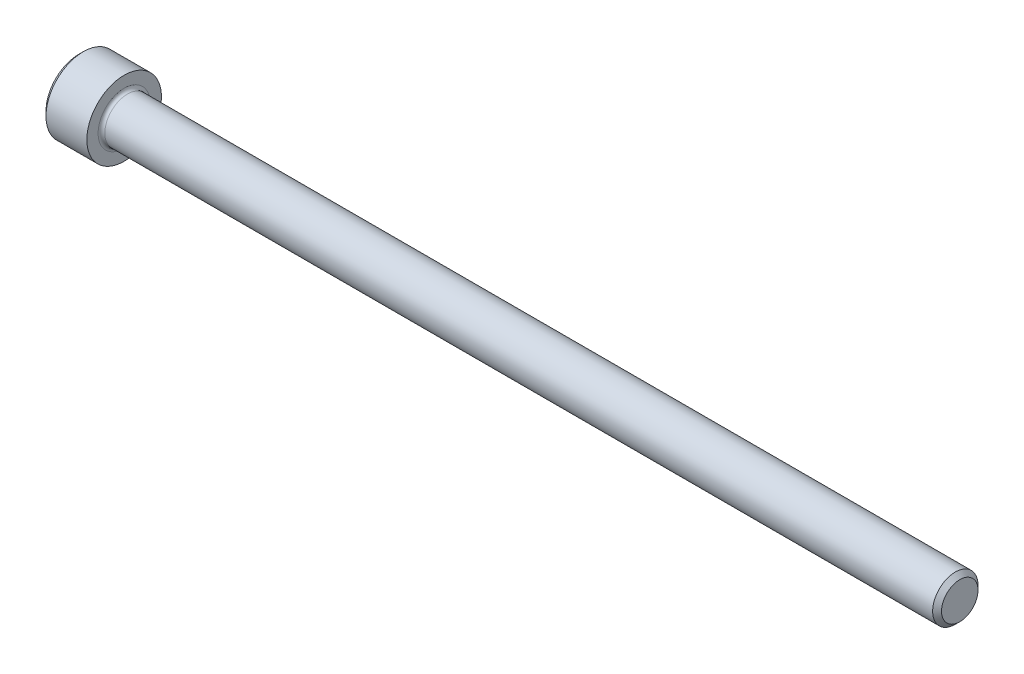
ISO-10303-21;
HEADER;
FILE_DESCRIPTION(('STEP AP214'),'2;1');
FILE_NAME('part.step','',(''),(''),'','','');
FILE_SCHEMA(('AUTOMOTIVE_DESIGN { 1 0 10303 214 1 1 1 1 }'));
ENDSEC;
DATA;
#1=APPLICATION_CONTEXT('core data for automotive mechanical design processes');
#2=APPLICATION_PROTOCOL_DEFINITION('international standard','automotive_design',2000,#1);
#3=PRODUCT_CONTEXT('',#1,'mechanical');
#4=PRODUCT('Part','Part','',(#3));
#5=PRODUCT_RELATED_PRODUCT_CATEGORY('part','',(#4));
#6=PRODUCT_DEFINITION_FORMATION('','',#4);
#7=PRODUCT_DEFINITION_CONTEXT('part definition',#1,'design');
#8=PRODUCT_DEFINITION('design','',#6,#7);
#9=PRODUCT_DEFINITION_SHAPE('','',#8);
#10=(LENGTH_UNIT() NAMED_UNIT(*) SI_UNIT(.MILLI.,.METRE.));
#11=(NAMED_UNIT(*) PLANE_ANGLE_UNIT() SI_UNIT($,.RADIAN.));
#12=(NAMED_UNIT(*) SI_UNIT($,.STERADIAN.) SOLID_ANGLE_UNIT());
#13=UNCERTAINTY_MEASURE_WITH_UNIT(LENGTH_MEASURE(1.E-05),#10,'distance_accuracy_value','');
#14=(GEOMETRIC_REPRESENTATION_CONTEXT(3) GLOBAL_UNCERTAINTY_ASSIGNED_CONTEXT((#13)) GLOBAL_UNIT_ASSIGNED_CONTEXT((#10,
#11,#12)) REPRESENTATION_CONTEXT('',''));
#15=CARTESIAN_POINT('',(0.,0.,0.));
#16=DIRECTION('',(0.,0.,1.));
#17=DIRECTION('',(1.,0.,0.));
#18=AXIS2_PLACEMENT_3D('',#15,#16,#17);
#19=CARTESIAN_POINT('',(2.286,3.4381381735323,-1.98501));
#20=DIRECTION('',(1.,0.,0.));
#21=DIRECTION('',(0.,0.,-1.));
#22=AXIS2_PLACEMENT_3D('',#19,#20,#21);
#23=PLANE('',#22);
#24=DIRECTION('',(0.,1.,0.));
#25=VECTOR('',#24,1.);
#26=CARTESIAN_POINT('',(2.286,3.4381381735323,1.98501));
#27=LINE('',#26,#25);
#28=CARTESIAN_POINT('',(2.28600000001322,0.,1.98501000002768));
#29=VERTEX_POINT('',#28);
#30=CARTESIAN_POINT('',(2.286,-1.14604605784409,1.98501));
#31=VERTEX_POINT('',#30);
#32=EDGE_CURVE('E96',#29,#31,#27,.F.);
#33=ORIENTED_EDGE('',*,*,#32,.F.);
#34=CARTESIAN_POINT('',(2.28600000002643,0.,0.));
#35=DIRECTION('',(-1.,0.,0.));
#36=DIRECTION('',(0.,0.,1.));
#37=AXIS2_PLACEMENT_3D('',#34,#35,#36);
#38=CIRCLE('',#37,1.98501000005535);
#39=CARTESIAN_POINT('',(2.28600000001322,-1.71906908679011,0.992505000013839));
#40=VERTEX_POINT('',#39);
#41=EDGE_CURVE('E98',#29,#40,#38,.F.);
#42=ORIENTED_EDGE('',*,*,#41,.T.);
#43=DIRECTION('',(0.,-0.5,-0.866025403784438));
#44=VECTOR('',#43,1.);
#45=CARTESIAN_POINT('',(2.286,-1.14604605784409,1.98501));
#46=LINE('',#45,#44);
#47=EDGE_CURVE('E101',#31,#40,#46,.T.);
#48=ORIENTED_EDGE('',*,*,#47,.F.);
#49=EDGE_LOOP('',(#33,#42,#48));
#50=FACE_BOUND('',#49,.T.);
#51=ADVANCED_FACE('F17',(#50),#23,.F.);
#52=CARTESIAN_POINT('',(2.286,3.4381381735323,-1.98501));
#53=DIRECTION('',(1.,0.,0.));
#54=DIRECTION('',(0.,0.,-1.));
#55=AXIS2_PLACEMENT_3D('',#52,#53,#54);
#56=PLANE('',#55);
#57=DIRECTION('',(0.,-0.500000000000002,-0.866025403784438));
#58=VECTOR('',#57,1.);
#59=CARTESIAN_POINT('',(2.286,-1.71906908676614,0.992504999999999));
#60=LINE('',#59,#58);
#61=CARTESIAN_POINT('',(2.286,-2.29209211568819,0.));
#62=VERTEX_POINT('',#61);
#63=EDGE_CURVE('E169',#40,#62,#60,.T.);
#64=ORIENTED_EDGE('',*,*,#63,.F.);
#65=CARTESIAN_POINT('',(2.28600000002643,0.,0.));
#66=DIRECTION('',(-1.,0.,0.));
#67=DIRECTION('',(0.,0.,1.));
#68=AXIS2_PLACEMENT_3D('',#65,#66,#67);
#69=CIRCLE('',#68,1.98501000005535);
#70=CARTESIAN_POINT('',(2.28600000001322,-1.71906908679012,-0.992505000013834));
#71=VERTEX_POINT('',#70);
#72=EDGE_CURVE('E116',#40,#71,#69,.F.);
#73=ORIENTED_EDGE('',*,*,#72,.T.);
#74=DIRECTION('',(0.,0.499999999999999,-0.866025403784439));
#75=VECTOR('',#74,1.);
#76=CARTESIAN_POINT('',(2.286,-2.29209211568819,0.));
#77=LINE('',#76,#75);
#78=EDGE_CURVE('E165',#62,#71,#77,.T.);
#79=ORIENTED_EDGE('',*,*,#78,.F.);
#80=EDGE_LOOP('',(#64,#73,#79));
#81=FACE_BOUND('',#80,.T.);
#82=ADVANCED_FACE('F341',(#81),#56,.F.);
#83=CARTESIAN_POINT('',(2.286,3.4381381735323,-1.98501));
#84=DIRECTION('',(1.,0.,0.));
#85=DIRECTION('',(0.,0.,-1.));
#86=AXIS2_PLACEMENT_3D('',#83,#84,#85);
#87=PLANE('',#86);
#88=DIRECTION('',(0.,0.499999999999997,-0.86602540378444));
#89=VECTOR('',#88,1.);
#90=CARTESIAN_POINT('',(2.286,-1.71906908676615,-0.992504999999994));
#91=LINE('',#90,#89);
#92=CARTESIAN_POINT('',(2.286,-1.1460460578441,-1.98501));
#93=VERTEX_POINT('',#92);
#94=EDGE_CURVE('E161',#71,#93,#91,.T.);
#95=ORIENTED_EDGE('',*,*,#94,.F.);
#96=CARTESIAN_POINT('',(2.28600000002643,0.,0.));
#97=DIRECTION('',(-1.,0.,0.));
#98=DIRECTION('',(0.,0.,1.));
#99=AXIS2_PLACEMENT_3D('',#96,#97,#98);
#100=CIRCLE('',#99,1.98501000005535);
#101=CARTESIAN_POINT('',(2.28600000001322,0.,-1.98501000002768));
#102=VERTEX_POINT('',#101);
#103=EDGE_CURVE('E218',#71,#102,#100,.F.);
#104=ORIENTED_EDGE('',*,*,#103,.T.);
#105=DIRECTION('',(0.,1.,0.));
#106=VECTOR('',#105,1.);
#107=CARTESIAN_POINT('',(2.286,3.4381381735323,-1.98501));
#108=LINE('',#107,#106);
#109=EDGE_CURVE('E157',#93,#102,#108,.T.);
#110=ORIENTED_EDGE('',*,*,#109,.F.);
#111=EDGE_LOOP('',(#95,#104,#110));
#112=FACE_BOUND('',#111,.T.);
#113=ADVANCED_FACE('F338',(#112),#87,.F.);
#114=CARTESIAN_POINT('',(2.286,3.4381381735323,-1.98501));
#115=DIRECTION('',(1.,0.,0.));
#116=DIRECTION('',(0.,0.,-1.));
#117=AXIS2_PLACEMENT_3D('',#114,#115,#116);
#118=PLANE('',#117);
#119=DIRECTION('',(0.,1.,0.));
#120=VECTOR('',#119,1.);
#121=CARTESIAN_POINT('',(2.286,3.4381381735323,-1.98501));
#122=LINE('',#121,#120);
#123=CARTESIAN_POINT('',(2.286,1.1460460578441,-1.98501));
#124=VERTEX_POINT('',#123);
#125=EDGE_CURVE('E153',#102,#124,#122,.T.);
#126=ORIENTED_EDGE('',*,*,#125,.F.);
#127=CARTESIAN_POINT('',(2.28600000002643,0.,0.));
#128=DIRECTION('',(-1.,0.,0.));
#129=DIRECTION('',(0.,0.,1.));
#130=AXIS2_PLACEMENT_3D('',#127,#128,#129);
#131=CIRCLE('',#130,1.98501000005535);
#132=CARTESIAN_POINT('',(2.28600000001322,1.71906908679012,-0.992505000013842));
#133=VERTEX_POINT('',#132);
#134=EDGE_CURVE('E215',#102,#133,#131,.F.);
#135=ORIENTED_EDGE('',*,*,#134,.T.);
#136=DIRECTION('',(0.,0.500000000000001,0.866025403784438));
#137=VECTOR('',#136,1.);
#138=CARTESIAN_POINT('',(2.286,1.1460460578441,-1.98501));
#139=LINE('',#138,#137);
#140=EDGE_CURVE('E149',#124,#133,#139,.T.);
#141=ORIENTED_EDGE('',*,*,#140,.F.);
#142=EDGE_LOOP('',(#126,#135,#141));
#143=FACE_BOUND('',#142,.T.);
#144=ADVANCED_FACE('F334',(#143),#118,.F.);
#145=CARTESIAN_POINT('',(2.286,3.4381381735323,-1.98501));
#146=DIRECTION('',(1.,0.,0.));
#147=DIRECTION('',(0.,0.,-1.));
#148=AXIS2_PLACEMENT_3D('',#145,#146,#147);
#149=PLANE('',#148);
#150=DIRECTION('',(0.,0.500000000000001,0.866025403784438));
#151=VECTOR('',#150,1.);
#152=CARTESIAN_POINT('',(2.286,1.71906908676615,-0.992505000000004));
#153=LINE('',#152,#151);
#154=CARTESIAN_POINT('',(2.286,2.2920921156882,0.));
#155=VERTEX_POINT('',#154);
#156=EDGE_CURVE('E145',#133,#155,#153,.T.);
#157=ORIENTED_EDGE('',*,*,#156,.F.);
#158=CARTESIAN_POINT('',(2.28600000002643,0.,0.));
#159=DIRECTION('',(-1.,0.,0.));
#160=DIRECTION('',(0.,0.,1.));
#161=AXIS2_PLACEMENT_3D('',#158,#159,#160);
#162=CIRCLE('',#161,1.98501000005535);
#163=CARTESIAN_POINT('',(2.28600000001322,1.71906908679012,0.992505000013836));
#164=VERTEX_POINT('',#163);
#165=EDGE_CURVE('E124',#133,#164,#162,.F.);
#166=ORIENTED_EDGE('',*,*,#165,.T.);
#167=DIRECTION('',(0.,-0.499999999999999,0.866025403784439));
#168=VECTOR('',#167,1.);
#169=CARTESIAN_POINT('',(2.286,2.2920921156882,0.));
#170=LINE('',#169,#168);
#171=EDGE_CURVE('E117',#155,#164,#170,.T.);
#172=ORIENTED_EDGE('',*,*,#171,.F.);
#173=EDGE_LOOP('',(#157,#166,#172));
#174=FACE_BOUND('',#173,.T.);
#175=ADVANCED_FACE('F330',(#174),#149,.F.);
#176=CARTESIAN_POINT('',(2.28600000002643,0.,0.));
#177=DIRECTION('',(-1.,0.,0.));
#178=DIRECTION('',(0.,0.,1.));
#179=AXIS2_PLACEMENT_3D('',#176,#177,#178);
#180=CONICAL_SURFACE('',#179,1.98501000005535,1.04719755117615);
#181=CARTESIAN_POINT('',(3.43204605781011,0.,1.70530256582424E-10));
#182=VERTEX_POINT('',#181);
#183=VERTEX_LOOP('',#182);
#184=FACE_BOUND('',#183,.T.);
#185=ORIENTED_EDGE('',*,*,#41,.F.);
#186=CARTESIAN_POINT('',(2.28600000002643,0.,0.));
#187=DIRECTION('',(-1.,0.,0.));
#188=DIRECTION('',(0.,0.,1.));
#189=AXIS2_PLACEMENT_3D('',#186,#187,#188);
#190=CIRCLE('',#189,1.98501000005535);
#191=EDGE_CURVE('E112',#29,#164,#190,.T.);
#192=ORIENTED_EDGE('',*,*,#191,.T.);
#193=ORIENTED_EDGE('',*,*,#165,.F.);
#194=ORIENTED_EDGE('',*,*,#134,.F.);
#195=ORIENTED_EDGE('',*,*,#103,.F.);
#196=ORIENTED_EDGE('',*,*,#72,.F.);
#197=EDGE_LOOP('',(#185,#192,#193,#194,#195,#196));
#198=FACE_BOUND('',#197,.T.);
#199=ADVANCED_FACE('F110',(#184,#198),#180,.F.);
#200=CARTESIAN_POINT('',(2.286,3.4381381735323,-1.98501));
#201=DIRECTION('',(1.,0.,0.));
#202=DIRECTION('',(0.,0.,-1.));
#203=AXIS2_PLACEMENT_3D('',#200,#201,#202);
#204=PLANE('',#203);
#205=DIRECTION('',(0.,0.499999999999999,-0.866025403784439));
#206=VECTOR('',#205,1.);
#207=CARTESIAN_POINT('',(2.286,2.2920921156882,0.));
#208=LINE('',#207,#206);
#209=CARTESIAN_POINT('',(2.286,1.14604605784411,1.98501));
#210=VERTEX_POINT('',#209);
#211=EDGE_CURVE('E123',#164,#210,#208,.F.);
#212=ORIENTED_EDGE('',*,*,#211,.F.);
#213=ORIENTED_EDGE('',*,*,#191,.F.);
#214=DIRECTION('',(0.,-1.,0.));
#215=VECTOR('',#214,1.);
#216=CARTESIAN_POINT('',(2.286,-1.14604605784409,1.98501));
#217=LINE('',#216,#215);
#218=EDGE_CURVE('E121',#29,#210,#217,.F.);
#219=ORIENTED_EDGE('',*,*,#218,.T.);
#220=EDGE_LOOP('',(#212,#213,#219));
#221=FACE_BOUND('',#220,.T.);
#222=ADVANCED_FACE('F120',(#221),#204,.F.);
#223=CARTESIAN_POINT('',(2.286,2.2920921156882,0.));
#224=DIRECTION('',(0.,-0.866025403784439,-0.499999999999999));
#225=DIRECTION('',(0.,0.499999999999999,-0.866025403784439));
#226=AXIS2_PLACEMENT_3D('',#223,#224,#225);
#227=PLANE('',#226);
#228=ORIENTED_EDGE('',*,*,#211,.T.);
#229=DIRECTION('',(1.,0.,0.));
#230=VECTOR('',#229,1.);
#231=CARTESIAN_POINT('',(2.286,1.14604605784411,1.98501));
#232=LINE('',#231,#230);
#233=CARTESIAN_POINT('',(0.,1.14604605784411,1.98501));
#234=VERTEX_POINT('',#233);
#235=EDGE_CURVE('E129',#210,#234,#232,.F.);
#236=ORIENTED_EDGE('',*,*,#235,.T.);
#237=DIRECTION('',(0.,-0.499999999999999,0.866025403784439));
#238=VECTOR('',#237,1.);
#239=CARTESIAN_POINT('',(0.,2.2920921156882,0.));
#240=LINE('',#239,#238);
#241=CARTESIAN_POINT('',(0.,2.2920921156882,0.));
#242=VERTEX_POINT('',#241);
#243=EDGE_CURVE('E136',#242,#234,#240,.T.);
#244=ORIENTED_EDGE('',*,*,#243,.F.);
#245=DIRECTION('',(1.,0.,0.));
#246=VECTOR('',#245,1.);
#247=CARTESIAN_POINT('',(2.286,2.2920921156882,0.));
#248=LINE('',#247,#246);
#249=EDGE_CURVE('E180',#242,#155,#248,.T.);
#250=ORIENTED_EDGE('',*,*,#249,.T.);
#251=ORIENTED_EDGE('',*,*,#171,.T.);
#252=EDGE_LOOP('',(#228,#236,#244,#250,#251));
#253=FACE_BOUND('',#252,.T.);
#254=ADVANCED_FACE('F322',(#253),#227,.T.);
#255=CARTESIAN_POINT('',(2.286,-1.14604605784409,1.98501));
#256=DIRECTION('',(0.,0.,1.));
#257=DIRECTION('',(0.,-1.,0.));
#258=AXIS2_PLACEMENT_3D('',#255,#256,#257);
#259=PLANE('',#258);
#260=ORIENTED_EDGE('',*,*,#235,.F.);
#261=ORIENTED_EDGE('',*,*,#218,.F.);
#262=ORIENTED_EDGE('',*,*,#32,.T.);
#263=DIRECTION('',(1.,0.,0.));
#264=VECTOR('',#263,1.);
#265=CARTESIAN_POINT('',(2.286,-1.14604605784409,1.98501));
#266=LINE('',#265,#264);
#267=CARTESIAN_POINT('',(0.,-1.14604605784409,1.98501));
#268=VERTEX_POINT('',#267);
#269=EDGE_CURVE('E131',#268,#31,#266,.T.);
#270=ORIENTED_EDGE('',*,*,#269,.F.);
#271=DIRECTION('',(0.,1.,0.));
#272=VECTOR('',#271,1.);
#273=CARTESIAN_POINT('',(0.,0.,1.98501));
#274=LINE('',#273,#272);
#275=EDGE_CURVE('E364',#234,#268,#274,.F.);
#276=ORIENTED_EDGE('',*,*,#275,.F.);
#277=EDGE_LOOP('',(#260,#261,#262,#270,#276));
#278=FACE_BOUND('',#277,.T.);
#279=ADVANCED_FACE('F127',(#278),#259,.F.);
#280=CARTESIAN_POINT('',(2.286,-1.14604605784409,1.98501));
#281=DIRECTION('',(0.,0.866025403784438,-0.500000000000001));
#282=DIRECTION('',(0.,0.500000000000001,0.866025403784438));
#283=AXIS2_PLACEMENT_3D('',#280,#281,#282);
#284=PLANE('',#283);
#285=ORIENTED_EDGE('',*,*,#63,.T.);
#286=DIRECTION('',(1.,0.,0.));
#287=VECTOR('',#286,1.);
#288=CARTESIAN_POINT('',(2.286,-2.29209211568819,0.));
#289=LINE('',#288,#287);
#290=CARTESIAN_POINT('',(0.,-2.29209211568819,0.));
#291=VERTEX_POINT('',#290);
#292=EDGE_CURVE('E191',#291,#62,#289,.T.);
#293=ORIENTED_EDGE('',*,*,#292,.F.);
#294=DIRECTION('',(0.,-0.500000000000001,-0.866025403784438));
#295=VECTOR('',#294,1.);
#296=CARTESIAN_POINT('',(0.,-1.14604605784409,1.98501));
#297=LINE('',#296,#295);
#298=EDGE_CURVE('E360',#268,#291,#297,.T.);
#299=ORIENTED_EDGE('',*,*,#298,.F.);
#300=ORIENTED_EDGE('',*,*,#269,.T.);
#301=ORIENTED_EDGE('',*,*,#47,.T.);
#302=EDGE_LOOP('',(#285,#293,#299,#300,#301));
#303=FACE_BOUND('',#302,.T.);
#304=ADVANCED_FACE('F315',(#303),#284,.T.);
#305=CARTESIAN_POINT('',(2.286,-2.29209211568819,0.));
#306=DIRECTION('',(0.,0.86602540378444,0.499999999999998));
#307=DIRECTION('',(0.,-0.499999999999998,0.86602540378444));
#308=AXIS2_PLACEMENT_3D('',#305,#306,#307);
#309=PLANE('',#308);
#310=ORIENTED_EDGE('',*,*,#94,.T.);
#311=DIRECTION('',(1.,0.,0.));
#312=VECTOR('',#311,1.);
#313=CARTESIAN_POINT('',(2.286,-1.1460460578441,-1.98501));
#314=LINE('',#313,#312);
#315=CARTESIAN_POINT('',(0.,-1.1460460578441,-1.98501));
#316=VERTEX_POINT('',#315);
#317=EDGE_CURVE('E184',#93,#316,#314,.F.);
#318=ORIENTED_EDGE('',*,*,#317,.T.);
#319=DIRECTION('',(0.,0.499999999999998,-0.866025403784439));
#320=VECTOR('',#319,1.);
#321=CARTESIAN_POINT('',(0.,-2.29209211568819,0.));
#322=LINE('',#321,#320);
#323=EDGE_CURVE('E353',#291,#316,#322,.T.);
#324=ORIENTED_EDGE('',*,*,#323,.F.);
#325=ORIENTED_EDGE('',*,*,#292,.T.);
#326=ORIENTED_EDGE('',*,*,#78,.T.);
#327=EDGE_LOOP('',(#310,#318,#324,#325,#326));
#328=FACE_BOUND('',#327,.T.);
#329=ADVANCED_FACE('F311',(#328),#309,.T.);
#330=CARTESIAN_POINT('',(2.286,1.1460460578441,-1.98501));
#331=DIRECTION('',(0.,0.,-1.));
#332=DIRECTION('',(0.,1.,0.));
#333=AXIS2_PLACEMENT_3D('',#330,#331,#332);
#334=PLANE('',#333);
#335=ORIENTED_EDGE('',*,*,#317,.F.);
#336=ORIENTED_EDGE('',*,*,#109,.T.);
#337=ORIENTED_EDGE('',*,*,#125,.T.);
#338=DIRECTION('',(1.,0.,0.));
#339=VECTOR('',#338,1.);
#340=CARTESIAN_POINT('',(2.286,1.1460460578441,-1.98501));
#341=LINE('',#340,#339);
#342=CARTESIAN_POINT('',(0.,1.1460460578441,-1.98501));
#343=VERTEX_POINT('',#342);
#344=EDGE_CURVE('E183',#124,#343,#341,.F.);
#345=ORIENTED_EDGE('',*,*,#344,.T.);
#346=DIRECTION('',(0.,1.,0.));
#347=VECTOR('',#346,1.);
#348=CARTESIAN_POINT('',(0.,0.,-1.98501));
#349=LINE('',#348,#347);
#350=EDGE_CURVE('E359',#316,#343,#349,.T.);
#351=ORIENTED_EDGE('',*,*,#350,.F.);
#352=EDGE_LOOP('',(#335,#336,#337,#345,#351));
#353=FACE_BOUND('',#352,.T.);
#354=ADVANCED_FACE('F307',(#353),#334,.F.);
#355=CARTESIAN_POINT('',(2.286,2.2920921156882,0.));
#356=DIRECTION('',(0.,0.866025403784438,-0.500000000000001));
#357=DIRECTION('',(0.,0.500000000000001,0.866025403784438));
#358=AXIS2_PLACEMENT_3D('',#355,#356,#357);
#359=PLANE('',#358);
#360=ORIENTED_EDGE('',*,*,#344,.F.);
#361=ORIENTED_EDGE('',*,*,#140,.T.);
#362=ORIENTED_EDGE('',*,*,#156,.T.);
#363=ORIENTED_EDGE('',*,*,#249,.F.);
#364=DIRECTION('',(0.,0.500000000000001,0.866025403784438));
#365=VECTOR('',#364,1.);
#366=CARTESIAN_POINT('',(0.,1.1460460578441,-1.98501));
#367=LINE('',#366,#365);
#368=EDGE_CURVE('E211',#343,#242,#367,.T.);
#369=ORIENTED_EDGE('',*,*,#368,.F.);
#370=EDGE_LOOP('',(#360,#361,#362,#363,#369));
#371=FACE_BOUND('',#370,.T.);
#372=ADVANCED_FACE('F303',(#371),#359,.F.);
#373=CARTESIAN_POINT('',(0.,0.,0.));
#374=DIRECTION('',(-1.,0.,0.));
#375=DIRECTION('',(0.,0.,1.));
#376=AXIS2_PLACEMENT_3D('',#373,#374,#375);
#377=PLANE('',#376);
#378=CARTESIAN_POINT('',(-5.68435272810253E-11,0.,0.));
#379=DIRECTION('',(1.,0.,0.));
#380=DIRECTION('',(0.,0.,-1.));
#381=AXIS2_PLACEMENT_3D('',#378,#379,#380);
#382=CIRCLE('',#381,3.48615000001473);
#383=CARTESIAN_POINT('',(-5.68435272810253E-11,0.,-3.48615000001473));
#384=VERTEX_POINT('',#383);
#385=EDGE_CURVE('E209',#384,#384,#382,.T.);
#386=ORIENTED_EDGE('',*,*,#385,.F.);
#387=EDGE_LOOP('',(#386));
#388=FACE_BOUND('',#387,.T.);
#389=ORIENTED_EDGE('',*,*,#350,.T.);
#390=ORIENTED_EDGE('',*,*,#368,.T.);
#391=ORIENTED_EDGE('',*,*,#243,.T.);
#392=ORIENTED_EDGE('',*,*,#275,.T.);
#393=ORIENTED_EDGE('',*,*,#298,.T.);
#394=ORIENTED_EDGE('',*,*,#323,.T.);
#395=EDGE_LOOP('',(#389,#390,#391,#392,#393,#394));
#396=FACE_BOUND('',#395,.T.);
#397=ADVANCED_FACE('F295',(#388,#396),#377,.T.);
#398=CARTESIAN_POINT('',(0.482599999884314,0.,0.));
#399=DIRECTION('',(1.,0.,0.));
#400=DIRECTION('',(0.,0.,-1.));
#401=AXIS2_PLACEMENT_3D('',#398,#399,#400);
#402=CONICAL_SURFACE('',#401,3.96875000001273,0.785398163456341);
#403=ORIENTED_EDGE('',*,*,#385,.T.);
#404=EDGE_LOOP('',(#403));
#405=FACE_BOUND('',#404,.T.);
#406=CARTESIAN_POINT('',(0.4826,0.,0.));
#407=DIRECTION('',(-1.,0.,0.));
#408=DIRECTION('',(0.,0.,1.));
#409=AXIS2_PLACEMENT_3D('',#406,#407,#408);
#410=CIRCLE('',#409,3.96875);
#411=CARTESIAN_POINT('',(0.4826,0.,3.96875));
#412=VERTEX_POINT('',#411);
#413=EDGE_CURVE('E208',#412,#412,#410,.F.);
#414=ORIENTED_EDGE('',*,*,#413,.F.);
#415=EDGE_LOOP('',(#414));
#416=FACE_BOUND('',#415,.T.);
#417=ADVANCED_FACE('F290',(#405,#416),#402,.T.);
#418=CARTESIAN_POINT('',(-31.75,0.,0.));
#419=DIRECTION('',(-1.,0.,0.));
#420=DIRECTION('',(0.,0.,1.));
#421=AXIS2_PLACEMENT_3D('',#418,#419,#420);
#422=CYLINDRICAL_SURFACE('',#421,3.96875);
#423=CARTESIAN_POINT('',(4.826,0.,0.));
#424=DIRECTION('',(-1.,0.,0.));
#425=DIRECTION('',(0.,0.,1.));
#426=AXIS2_PLACEMENT_3D('',#423,#424,#425);
#427=CIRCLE('',#426,3.96875);
#428=CARTESIAN_POINT('',(4.826,0.,3.96875));
#429=VERTEX_POINT('',#428);
#430=EDGE_CURVE('E205',#429,#429,#427,.F.);
#431=ORIENTED_EDGE('',*,*,#430,.F.);
#432=EDGE_LOOP('',(#431));
#433=FACE_BOUND('',#432,.T.);
#434=ORIENTED_EDGE('',*,*,#413,.T.);
#435=EDGE_LOOP('',(#434));
#436=FACE_BOUND('',#435,.T.);
#437=ADVANCED_FACE('F286',(#433,#436),#422,.T.);
#438=CARTESIAN_POINT('',(93.726,1.94056,0.));
#439=DIRECTION('',(1.,0.,0.));
#440=DIRECTION('',(0.,0.,-1.));
#441=AXIS2_PLACEMENT_3D('',#438,#439,#440);
#442=PLANE('',#441);
#443=CARTESIAN_POINT('',(93.7260000000038,0.,0.));
#444=DIRECTION('',(-1.,0.,0.));
#445=DIRECTION('',(0.,0.,1.));
#446=AXIS2_PLACEMENT_3D('',#443,#444,#445);
#447=CIRCLE('',#446,1.94055999998);
#448=CARTESIAN_POINT('',(93.7260000000038,0.,1.94055999998));
#449=VERTEX_POINT('',#448);
#450=EDGE_CURVE('E201',#449,#449,#447,.T.);
#451=ORIENTED_EDGE('',*,*,#450,.F.);
#452=EDGE_LOOP('',(#451));
#453=FACE_BOUND('',#452,.T.);
#454=ADVANCED_FACE('F244',(#453),#442,.T.);
#455=CARTESIAN_POINT('',(4.826,3.96875,0.));
#456=DIRECTION('',(1.,0.,0.));
#457=DIRECTION('',(0.,0.,-1.));
#458=AXIS2_PLACEMENT_3D('',#455,#456,#457);
#459=PLANE('',#458);
#460=ORIENTED_EDGE('',*,*,#430,.T.);
#461=EDGE_LOOP('',(#460));
#462=FACE_BOUND('',#461,.T.);
#463=CARTESIAN_POINT('',(4.826,0.,0.));
#464=DIRECTION('',(1.,0.,0.));
#465=DIRECTION('',(0.,0.,1.));
#466=AXIS2_PLACEMENT_3D('',#463,#464,#465);
#467=CIRCLE('',#466,2.76859999999994);
#468=CARTESIAN_POINT('',(4.826,0.,-2.76859999999994));
#469=VERTEX_POINT('',#468);
#470=CARTESIAN_POINT('',(4.826,0.,2.76859999999994));
#471=VERTEX_POINT('',#470);
#472=EDGE_CURVE('E204',#469,#471,#467,.F.);
#473=ORIENTED_EDGE('',*,*,#472,.T.);
#474=CARTESIAN_POINT('',(4.826,0.,0.));
#475=DIRECTION('',(1.,0.,0.));
#476=DIRECTION('',(0.,0.,-1.));
#477=AXIS2_PLACEMENT_3D('',#474,#475,#476);
#478=CIRCLE('',#477,2.76859999999994);
#479=EDGE_CURVE('E36',#471,#469,#478,.F.);
#480=ORIENTED_EDGE('',*,*,#479,.T.);
#481=EDGE_LOOP('',(#473,#480));
#482=FACE_BOUND('',#481,.T.);
#483=ADVANCED_FACE('F225',(#462,#482),#459,.T.);
#484=CARTESIAN_POINT('',(93.2535599999369,0.,0.));
#485=DIRECTION('',(-1.,0.,0.));
#486=DIRECTION('',(0.,0.,1.));
#487=AXIS2_PLACEMENT_3D('',#484,#485,#486);
#488=CONICAL_SURFACE('',#487,2.41299999999001,0.785398163337289);
#489=CARTESIAN_POINT('',(93.2535599999999,0.,0.));
#490=DIRECTION('',(-1.,0.,0.));
#491=DIRECTION('',(0.,0.,1.));
#492=AXIS2_PLACEMENT_3D('',#489,#490,#491);
#493=CIRCLE('',#492,2.41299999999994);
#494=CARTESIAN_POINT('',(93.2535599999999,0.,2.41299999999994));
#495=VERTEX_POINT('',#494);
#496=EDGE_CURVE('E28',#495,#495,#493,.T.);
#497=ORIENTED_EDGE('',*,*,#496,.F.);
#498=EDGE_LOOP('',(#497));
#499=FACE_BOUND('',#498,.T.);
#500=ORIENTED_EDGE('',*,*,#450,.T.);
#501=EDGE_LOOP('',(#500));
#502=FACE_BOUND('',#501,.T.);
#503=ADVANCED_FACE('F243',(#499,#502),#488,.T.);
#504=CARTESIAN_POINT('',(5.1816,0.,0.));
#505=DIRECTION('',(1.,0.,0.));
#506=DIRECTION('',(0.,0.,-1.));
#507=AXIS2_PLACEMENT_3D('',#504,#505,#506);
#508=TOROIDAL_SURFACE('',#507,2.76859999999994,0.3556);
#509=CARTESIAN_POINT('',(5.1816,0.,0.));
#510=DIRECTION('',(-1.,0.,0.));
#511=DIRECTION('',(0.,0.,1.));
#512=AXIS2_PLACEMENT_3D('',#509,#510,#511);
#513=CIRCLE('',#512,2.41299999999994);
#514=CARTESIAN_POINT('',(5.1816,0.,2.41299999999994));
#515=VERTEX_POINT('',#514);
#516=EDGE_CURVE('E11',#515,#515,#513,.F.);
#517=ORIENTED_EDGE('',*,*,#516,.F.);
#518=EDGE_LOOP('',(#517));
#519=FACE_BOUND('',#518,.T.);
#520=ORIENTED_EDGE('',*,*,#472,.F.);
#521=ORIENTED_EDGE('',*,*,#479,.F.);
#522=EDGE_LOOP('',(#520,#521));
#523=FACE_BOUND('',#522,.T.);
#524=ADVANCED_FACE('F222',(#519,#523),#508,.F.);
#525=CARTESIAN_POINT('',(-31.75,0.,0.));
#526=DIRECTION('',(-1.,0.,0.));
#527=DIRECTION('',(0.,0.,1.));
#528=AXIS2_PLACEMENT_3D('',#525,#526,#527);
#529=CYLINDRICAL_SURFACE('',#528,2.41299999999994);
#530=ORIENTED_EDGE('',*,*,#516,.T.);
#531=EDGE_LOOP('',(#530));
#532=FACE_BOUND('',#531,.T.);
#533=ORIENTED_EDGE('',*,*,#496,.T.);
#534=EDGE_LOOP('',(#533));
#535=FACE_BOUND('',#534,.T.);
#536=ADVANCED_FACE('F268',(#532,#535),#529,.T.);
#537=CLOSED_SHELL('',(#51,#82,#113,#144,#175,#199,#222,#254,#279,#304,#329,#354,#372,#397,#417,
#437,#454,#483,#503,#524,#536));
#538=MANIFOLD_SOLID_BREP('B1',#537);
#539=ADVANCED_BREP_SHAPE_REPRESENTATION('',(#18,#538),#14);
#540=SHAPE_DEFINITION_REPRESENTATION(#9,#539);
ENDSEC;
END-ISO-10303-21;
